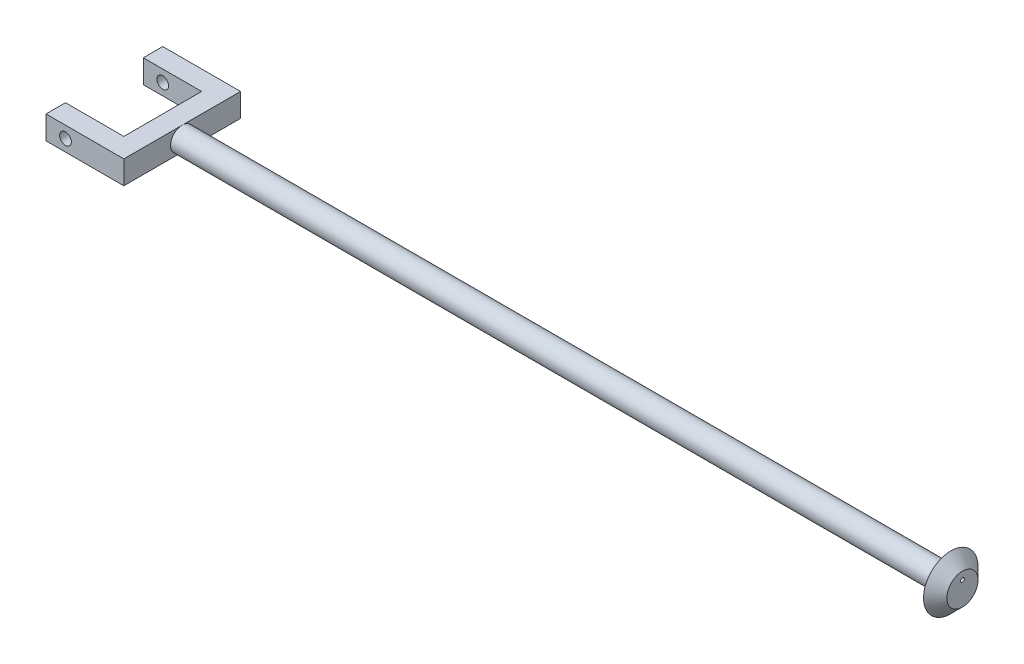
ISO-10303-21;
HEADER;
FILE_DESCRIPTION(('STEP AP214'),'2;1');
FILE_NAME('part.step','',(''),(''),'','','');
FILE_SCHEMA(('AUTOMOTIVE_DESIGN { 1 0 10303 214 1 1 1 1 }'));
ENDSEC;
DATA;
#1=APPLICATION_CONTEXT('core data for automotive mechanical design processes');
#2=APPLICATION_PROTOCOL_DEFINITION('international standard','automotive_design',2000,#1);
#3=PRODUCT_CONTEXT('',#1,'mechanical');
#4=PRODUCT('Part','Part','',(#3));
#5=PRODUCT_RELATED_PRODUCT_CATEGORY('part','',(#4));
#6=PRODUCT_DEFINITION_FORMATION('','',#4);
#7=PRODUCT_DEFINITION_CONTEXT('part definition',#1,'design');
#8=PRODUCT_DEFINITION('design','',#6,#7);
#9=PRODUCT_DEFINITION_SHAPE('','',#8);
#10=(LENGTH_UNIT() NAMED_UNIT(*) SI_UNIT(.MILLI.,.METRE.));
#11=(NAMED_UNIT(*) PLANE_ANGLE_UNIT() SI_UNIT($,.RADIAN.));
#12=(NAMED_UNIT(*) SI_UNIT($,.STERADIAN.) SOLID_ANGLE_UNIT());
#13=UNCERTAINTY_MEASURE_WITH_UNIT(LENGTH_MEASURE(1.E-05),#10,'distance_accuracy_value','');
#14=(GEOMETRIC_REPRESENTATION_CONTEXT(3) GLOBAL_UNCERTAINTY_ASSIGNED_CONTEXT((#13)) GLOBAL_UNIT_ASSIGNED_CONTEXT((#10,
#11,#12)) REPRESENTATION_CONTEXT('',''));
#15=CARTESIAN_POINT('',(0.,0.,0.));
#16=DIRECTION('',(0.,0.,1.));
#17=DIRECTION('',(1.,0.,0.));
#18=AXIS2_PLACEMENT_3D('',#15,#16,#17);
#19=CARTESIAN_POINT('',(-8.75000000000008,0.,-125.));
#20=DIRECTION('',(1.,0.,0.));
#21=DIRECTION('',(0.,0.,-1.));
#22=AXIS2_PLACEMENT_3D('',#19,#20,#21);
#23=PLANE('',#22);
#24=CARTESIAN_POINT('',(-8.75000000000008,0.,-125.));
#25=DIRECTION('',(-1.,0.,0.));
#26=DIRECTION('',(0.,0.,1.));
#27=AXIS2_PLACEMENT_3D('',#24,#25,#26);
#28=CIRCLE('',#27,1.5);
#29=CARTESIAN_POINT('',(-8.75000000000008,0.,-123.5));
#30=VERTEX_POINT('',#29);
#31=EDGE_CURVE('E11',#30,#30,#28,.T.);
#32=ORIENTED_EDGE('',*,*,#31,.F.);
#33=EDGE_LOOP('',(#32));
#34=FACE_BOUND('',#33,.T.);
#35=CARTESIAN_POINT('',(-8.75000000000008,0.,-125.));
#36=DIRECTION('',(1.,0.,0.));
#37=DIRECTION('',(0.,0.,-1.));
#38=AXIS2_PLACEMENT_3D('',#35,#36,#37);
#39=CIRCLE('',#38,3.50000000000003);
#40=CARTESIAN_POINT('',(-8.75000000000008,0.,-128.5));
#41=VERTEX_POINT('',#40);
#42=EDGE_CURVE('E226',#41,#41,#39,.T.);
#43=ORIENTED_EDGE('',*,*,#42,.F.);
#44=EDGE_LOOP('',(#43));
#45=FACE_BOUND('',#44,.T.);
#46=ADVANCED_FACE('F48',(#34,#45),#23,.F.);
#47=CARTESIAN_POINT('',(-100.,0.,-125.));
#48=DIRECTION('',(1.,0.,0.));
#49=DIRECTION('',(0.,0.,-1.));
#50=AXIS2_PLACEMENT_3D('',#47,#48,#49);
#51=CYLINDRICAL_SURFACE('',#50,1.5);
#52=ORIENTED_EDGE('',*,*,#31,.T.);
#53=EDGE_LOOP('',(#52));
#54=FACE_BOUND('',#53,.T.);
#55=CARTESIAN_POINT('',(-107.5,0.,-125.));
#56=DIRECTION('',(-1.,0.,0.));
#57=DIRECTION('',(0.,0.,1.));
#58=AXIS2_PLACEMENT_3D('',#55,#56,#57);
#59=CIRCLE('',#58,1.5);
#60=CARTESIAN_POINT('',(-107.5,1.5,-125.));
#61=VERTEX_POINT('',#60);
#62=CARTESIAN_POINT('',(-107.5,-1.5,-125.));
#63=VERTEX_POINT('',#62);
#64=EDGE_CURVE('E65',#61,#63,#59,.T.);
#65=ORIENTED_EDGE('',*,*,#64,.F.);
#66=EDGE_CURVE('E62',#63,#61,#59,.T.);
#67=ORIENTED_EDGE('',*,*,#66,.F.);
#68=EDGE_LOOP('',(#65,#67));
#69=FACE_BOUND('',#68,.T.);
#70=ADVANCED_FACE('F241',(#54,#69),#51,.T.);
#71=CARTESIAN_POINT('',(-8.75000000000008,0.,-125.));
#72=DIRECTION('',(-1.,0.,0.));
#73=DIRECTION('',(0.,0.,1.));
#74=AXIS2_PLACEMENT_3D('',#71,#72,#73);
#75=CONICAL_SURFACE('',#74,3.50000000000003,0.78539816339744);
#76=CARTESIAN_POINT('',(-7.25000000000008,0.,-125.));
#77=DIRECTION('',(1.,0.,0.));
#78=DIRECTION('',(0.,0.,-1.));
#79=AXIS2_PLACEMENT_3D('',#76,#77,#78);
#80=CIRCLE('',#79,2.00000000000006);
#81=CARTESIAN_POINT('',(-7.25000000000008,0.,-127.));
#82=VERTEX_POINT('',#81);
#83=EDGE_CURVE('E56',#82,#82,#80,.T.);
#84=ORIENTED_EDGE('',*,*,#83,.F.);
#85=EDGE_LOOP('',(#84));
#86=FACE_BOUND('',#85,.T.);
#87=ORIENTED_EDGE('',*,*,#42,.T.);
#88=EDGE_LOOP('',(#87));
#89=FACE_BOUND('',#88,.T.);
#90=ADVANCED_FACE('F238',(#86,#89),#75,.T.);
#91=CARTESIAN_POINT('',(-7.25000000000008,0.,-125.));
#92=DIRECTION('',(1.,0.,0.));
#93=DIRECTION('',(0.,0.,-1.));
#94=AXIS2_PLACEMENT_3D('',#91,#92,#93);
#95=PLANE('',#94);
#96=CARTESIAN_POINT('',(-7.25000000000008,1.00000000000003,-125.));
#97=DIRECTION('',(1.,0.,0.));
#98=DIRECTION('',(0.,0.,-1.));
#99=AXIS2_PLACEMENT_3D('',#96,#97,#98);
#100=CIRCLE('',#99,0.250000000000013);
#101=CARTESIAN_POINT('',(-7.25000000000008,1.00000000000003,-125.25));
#102=VERTEX_POINT('',#101);
#103=EDGE_CURVE('E221',#102,#102,#100,.T.);
#104=ORIENTED_EDGE('',*,*,#103,.F.);
#105=EDGE_LOOP('',(#104));
#106=FACE_BOUND('',#105,.T.);
#107=ORIENTED_EDGE('',*,*,#83,.T.);
#108=EDGE_LOOP('',(#107));
#109=FACE_BOUND('',#108,.T.);
#110=ADVANCED_FACE('F236',(#106,#109),#95,.T.);
#111=CARTESIAN_POINT('',(-8.25000000000008,1.00000000000003,-125.));
#112=DIRECTION('',(1.,0.,0.));
#113=DIRECTION('',(0.,0.,-1.));
#114=AXIS2_PLACEMENT_3D('',#111,#112,#113);
#115=CYLINDRICAL_SURFACE('',#114,0.250000000000013);
#116=CARTESIAN_POINT('',(-8.25000000000008,1.00000000000003,-125.));
#117=DIRECTION('',(1.,0.,0.));
#118=DIRECTION('',(0.,0.,-1.));
#119=AXIS2_PLACEMENT_3D('',#116,#117,#118);
#120=CIRCLE('',#119,0.250000000000013);
#121=CARTESIAN_POINT('',(-8.25000000000008,1.00000000000003,-125.25));
#122=VERTEX_POINT('',#121);
#123=EDGE_CURVE('E222',#122,#122,#120,.T.);
#124=ORIENTED_EDGE('',*,*,#123,.F.);
#125=EDGE_LOOP('',(#124));
#126=FACE_BOUND('',#125,.T.);
#127=ORIENTED_EDGE('',*,*,#103,.T.);
#128=EDGE_LOOP('',(#127));
#129=FACE_BOUND('',#128,.T.);
#130=ADVANCED_FACE('F261',(#126,#129),#115,.F.);
#131=CARTESIAN_POINT('',(-8.25000000000008,0.,0.));
#132=DIRECTION('',(1.,0.,0.));
#133=DIRECTION('',(0.,0.,-1.));
#134=AXIS2_PLACEMENT_3D('',#131,#132,#133);
#135=PLANE('',#134);
#136=ORIENTED_EDGE('',*,*,#123,.T.);
#137=EDGE_LOOP('',(#136));
#138=FACE_BOUND('',#137,.T.);
#139=ADVANCED_FACE('F266',(#138),#135,.T.);
#140=CARTESIAN_POINT('',(-107.5,-1.5,0.));
#141=DIRECTION('',(-1.,0.,0.));
#142=DIRECTION('',(0.,0.,1.));
#143=AXIS2_PLACEMENT_3D('',#140,#141,#142);
#144=PLANE('',#143);
#145=DIRECTION('',(0.,0.,1.));
#146=VECTOR('',#145,1.);
#147=CARTESIAN_POINT('',(-107.5,1.5,0.));
#148=LINE('',#147,#146);
#149=CARTESIAN_POINT('',(-107.5,1.5,-132.5));
#150=VERTEX_POINT('',#149);
#151=EDGE_CURVE('E149',#150,#61,#148,.T.);
#152=ORIENTED_EDGE('',*,*,#151,.T.);
#153=ORIENTED_EDGE('',*,*,#64,.T.);
#154=DIRECTION('',(0.,0.,1.));
#155=VECTOR('',#154,1.);
#156=CARTESIAN_POINT('',(-107.5,-1.5,0.));
#157=LINE('',#156,#155);
#158=CARTESIAN_POINT('',(-107.5,-1.5,-132.5));
#159=VERTEX_POINT('',#158);
#160=EDGE_CURVE('E178',#159,#63,#157,.T.);
#161=ORIENTED_EDGE('',*,*,#160,.F.);
#162=DIRECTION('',(0.,1.,0.));
#163=VECTOR('',#162,1.);
#164=CARTESIAN_POINT('',(-107.5,-1.5,-132.5));
#165=LINE('',#164,#163);
#166=EDGE_CURVE('E214',#159,#150,#165,.T.);
#167=ORIENTED_EDGE('',*,*,#166,.T.);
#168=EDGE_LOOP('',(#152,#153,#161,#167));
#169=FACE_BOUND('',#168,.T.);
#170=ADVANCED_FACE('F272',(#169),#144,.F.);
#171=CARTESIAN_POINT('',(-107.5,-1.5,-117.5));
#172=VERTEX_POINT('',#171);
#173=EDGE_CURVE('E177',#63,#172,#157,.T.);
#174=ORIENTED_EDGE('',*,*,#173,.F.);
#175=ORIENTED_EDGE('',*,*,#66,.T.);
#176=CARTESIAN_POINT('',(-107.5,1.5,-117.5));
#177=VERTEX_POINT('',#176);
#178=EDGE_CURVE('E146',#61,#177,#148,.T.);
#179=ORIENTED_EDGE('',*,*,#178,.T.);
#180=DIRECTION('',(0.,1.,0.));
#181=VECTOR('',#180,1.);
#182=CARTESIAN_POINT('',(-107.5,-1.5,-117.5));
#183=LINE('',#182,#181);
#184=EDGE_CURVE('E127',#172,#177,#183,.T.);
#185=ORIENTED_EDGE('',*,*,#184,.F.);
#186=EDGE_LOOP('',(#174,#175,#179,#185));
#187=FACE_BOUND('',#186,.T.);
#188=ADVANCED_FACE('F280',(#187),#144,.F.);
#189=CARTESIAN_POINT('',(-117.5,-1.5,0.));
#190=DIRECTION('',(1.,0.,0.));
#191=DIRECTION('',(0.,0.,-1.));
#192=AXIS2_PLACEMENT_3D('',#189,#190,#191);
#193=PLANE('',#192);
#194=DIRECTION('',(0.,1.,0.));
#195=VECTOR('',#194,1.);
#196=CARTESIAN_POINT('',(-117.5,-1.5,-117.5));
#197=LINE('',#196,#195);
#198=CARTESIAN_POINT('',(-117.5,-1.5,-117.5));
#199=VERTEX_POINT('',#198);
#200=CARTESIAN_POINT('',(-117.5,1.5,-117.5));
#201=VERTEX_POINT('',#200);
#202=EDGE_CURVE('E117',#199,#201,#197,.T.);
#203=ORIENTED_EDGE('',*,*,#202,.T.);
#204=DIRECTION('',(0.,0.,-1.));
#205=VECTOR('',#204,1.);
#206=CARTESIAN_POINT('',(-117.5,1.5,0.));
#207=LINE('',#206,#205);
#208=CARTESIAN_POINT('',(-117.5,1.5,-120.));
#209=VERTEX_POINT('',#208);
#210=EDGE_CURVE('E121',#201,#209,#207,.T.);
#211=ORIENTED_EDGE('',*,*,#210,.T.);
#212=DIRECTION('',(0.,1.,0.));
#213=VECTOR('',#212,1.);
#214=CARTESIAN_POINT('',(-117.5,-1.5,-120.));
#215=LINE('',#214,#213);
#216=CARTESIAN_POINT('',(-117.5,-1.5,-120.));
#217=VERTEX_POINT('',#216);
#218=EDGE_CURVE('E199',#217,#209,#215,.T.);
#219=ORIENTED_EDGE('',*,*,#218,.F.);
#220=DIRECTION('',(0.,0.,-1.));
#221=VECTOR('',#220,1.);
#222=CARTESIAN_POINT('',(-117.5,-1.5,0.));
#223=LINE('',#222,#221);
#224=EDGE_CURVE('E122',#199,#217,#223,.T.);
#225=ORIENTED_EDGE('',*,*,#224,.F.);
#226=EDGE_LOOP('',(#203,#211,#219,#225));
#227=FACE_BOUND('',#226,.T.);
#228=ADVANCED_FACE('F119',(#227),#193,.F.);
#229=CARTESIAN_POINT('',(0.,-1.5,-120.));
#230=DIRECTION('',(0.,0.,-1.));
#231=DIRECTION('',(-1.,0.,0.));
#232=AXIS2_PLACEMENT_3D('',#229,#230,#231);
#233=PLANE('',#232);
#234=CARTESIAN_POINT('',(-115.,0.,-120.));
#235=DIRECTION('',(0.,0.,-1.));
#236=DIRECTION('',(-1.,0.,0.));
#237=AXIS2_PLACEMENT_3D('',#234,#235,#236);
#238=CIRCLE('',#237,0.749999999999999);
#239=CARTESIAN_POINT('',(-115.75,0.,-120.));
#240=VERTEX_POINT('',#239);
#241=EDGE_CURVE('E140',#240,#240,#238,.T.);
#242=ORIENTED_EDGE('',*,*,#241,.F.);
#243=EDGE_LOOP('',(#242));
#244=FACE_BOUND('',#243,.T.);
#245=ORIENTED_EDGE('',*,*,#218,.T.);
#246=DIRECTION('',(-1.,0.,0.));
#247=VECTOR('',#246,1.);
#248=CARTESIAN_POINT('',(0.,1.5,-120.));
#249=LINE('',#248,#247);
#250=CARTESIAN_POINT('',(-110.,1.5,-120.));
#251=VERTEX_POINT('',#250);
#252=EDGE_CURVE('E138',#251,#209,#249,.T.);
#253=ORIENTED_EDGE('',*,*,#252,.F.);
#254=DIRECTION('',(0.,1.,0.));
#255=VECTOR('',#254,1.);
#256=CARTESIAN_POINT('',(-110.,-1.5,-120.));
#257=LINE('',#256,#255);
#258=CARTESIAN_POINT('',(-110.,-1.5,-120.));
#259=VERTEX_POINT('',#258);
#260=EDGE_CURVE('E202',#259,#251,#257,.T.);
#261=ORIENTED_EDGE('',*,*,#260,.F.);
#262=DIRECTION('',(-1.,0.,0.));
#263=VECTOR('',#262,1.);
#264=CARTESIAN_POINT('',(0.,-1.5,-120.));
#265=LINE('',#264,#263);
#266=EDGE_CURVE('E128',#259,#217,#265,.T.);
#267=ORIENTED_EDGE('',*,*,#266,.T.);
#268=EDGE_LOOP('',(#245,#253,#261,#267));
#269=FACE_BOUND('',#268,.T.);
#270=ADVANCED_FACE('F279',(#244,#269),#233,.T.);
#271=CARTESIAN_POINT('',(-110.,-1.5,0.));
#272=DIRECTION('',(-1.,0.,0.));
#273=DIRECTION('',(0.,0.,1.));
#274=AXIS2_PLACEMENT_3D('',#271,#272,#273);
#275=PLANE('',#274);
#276=ORIENTED_EDGE('',*,*,#260,.T.);
#277=DIRECTION('',(0.,0.,1.));
#278=VECTOR('',#277,1.);
#279=CARTESIAN_POINT('',(-110.,1.5,0.));
#280=LINE('',#279,#278);
#281=CARTESIAN_POINT('',(-110.,1.5,-130.));
#282=VERTEX_POINT('',#281);
#283=EDGE_CURVE('E167',#282,#251,#280,.T.);
#284=ORIENTED_EDGE('',*,*,#283,.F.);
#285=DIRECTION('',(0.,1.,0.));
#286=VECTOR('',#285,1.);
#287=CARTESIAN_POINT('',(-110.,-1.5,-130.));
#288=LINE('',#287,#286);
#289=CARTESIAN_POINT('',(-110.,-1.5,-130.));
#290=VERTEX_POINT('',#289);
#291=EDGE_CURVE('E205',#290,#282,#288,.T.);
#292=ORIENTED_EDGE('',*,*,#291,.F.);
#293=DIRECTION('',(0.,0.,1.));
#294=VECTOR('',#293,1.);
#295=CARTESIAN_POINT('',(-110.,-1.5,0.));
#296=LINE('',#295,#294);
#297=EDGE_CURVE('E192',#290,#259,#296,.T.);
#298=ORIENTED_EDGE('',*,*,#297,.T.);
#299=EDGE_LOOP('',(#276,#284,#292,#298));
#300=FACE_BOUND('',#299,.T.);
#301=ADVANCED_FACE('F298',(#300),#275,.T.);
#302=CARTESIAN_POINT('',(0.,-1.5,-130.));
#303=DIRECTION('',(0.,0.,-1.));
#304=DIRECTION('',(-1.,0.,0.));
#305=AXIS2_PLACEMENT_3D('',#302,#303,#304);
#306=PLANE('',#305);
#307=CARTESIAN_POINT('',(-115.,0.,-130.));
#308=DIRECTION('',(0.,0.,-1.));
#309=DIRECTION('',(-1.,0.,0.));
#310=AXIS2_PLACEMENT_3D('',#307,#308,#309);
#311=CIRCLE('',#310,0.749999999999999);
#312=CARTESIAN_POINT('',(-115.75,0.,-130.));
#313=VERTEX_POINT('',#312);
#314=EDGE_CURVE('E330',#313,#313,#311,.T.);
#315=ORIENTED_EDGE('',*,*,#314,.T.);
#316=EDGE_LOOP('',(#315));
#317=FACE_BOUND('',#316,.T.);
#318=ORIENTED_EDGE('',*,*,#291,.T.);
#319=DIRECTION('',(-1.,0.,0.));
#320=VECTOR('',#319,1.);
#321=CARTESIAN_POINT('',(0.,1.5,-130.));
#322=LINE('',#321,#320);
#323=CARTESIAN_POINT('',(-117.5,1.5,-130.));
#324=VERTEX_POINT('',#323);
#325=EDGE_CURVE('E163',#282,#324,#322,.T.);
#326=ORIENTED_EDGE('',*,*,#325,.T.);
#327=DIRECTION('',(0.,1.,0.));
#328=VECTOR('',#327,1.);
#329=CARTESIAN_POINT('',(-117.5,-1.5,-130.));
#330=LINE('',#329,#328);
#331=CARTESIAN_POINT('',(-117.5,-1.5,-130.));
#332=VERTEX_POINT('',#331);
#333=EDGE_CURVE('E208',#332,#324,#330,.T.);
#334=ORIENTED_EDGE('',*,*,#333,.F.);
#335=DIRECTION('',(-1.,0.,0.));
#336=VECTOR('',#335,1.);
#337=CARTESIAN_POINT('',(0.,-1.5,-130.));
#338=LINE('',#337,#336);
#339=EDGE_CURVE('E189',#290,#332,#338,.T.);
#340=ORIENTED_EDGE('',*,*,#339,.F.);
#341=EDGE_LOOP('',(#318,#326,#334,#340));
#342=FACE_BOUND('',#341,.T.);
#343=ADVANCED_FACE('F294',(#317,#342),#306,.F.);
#344=CARTESIAN_POINT('',(-117.5,-1.5,0.));
#345=DIRECTION('',(-1.,0.,0.));
#346=DIRECTION('',(0.,0.,1.));
#347=AXIS2_PLACEMENT_3D('',#344,#345,#346);
#348=PLANE('',#347);
#349=ORIENTED_EDGE('',*,*,#333,.T.);
#350=DIRECTION('',(0.,0.,1.));
#351=VECTOR('',#350,1.);
#352=CARTESIAN_POINT('',(-117.5,1.5,0.));
#353=LINE('',#352,#351);
#354=CARTESIAN_POINT('',(-117.5,1.5,-132.5));
#355=VERTEX_POINT('',#354);
#356=EDGE_CURVE('E159',#355,#324,#353,.T.);
#357=ORIENTED_EDGE('',*,*,#356,.F.);
#358=DIRECTION('',(0.,1.,0.));
#359=VECTOR('',#358,1.);
#360=CARTESIAN_POINT('',(-117.5,-1.5,-132.5));
#361=LINE('',#360,#359);
#362=CARTESIAN_POINT('',(-117.5,-1.5,-132.5));
#363=VERTEX_POINT('',#362);
#364=EDGE_CURVE('E211',#363,#355,#361,.T.);
#365=ORIENTED_EDGE('',*,*,#364,.F.);
#366=DIRECTION('',(0.,0.,1.));
#367=VECTOR('',#366,1.);
#368=CARTESIAN_POINT('',(-117.5,-1.5,0.));
#369=LINE('',#368,#367);
#370=EDGE_CURVE('E185',#363,#332,#369,.T.);
#371=ORIENTED_EDGE('',*,*,#370,.T.);
#372=EDGE_LOOP('',(#349,#357,#365,#371));
#373=FACE_BOUND('',#372,.T.);
#374=ADVANCED_FACE('F290',(#373),#348,.T.);
#375=CARTESIAN_POINT('',(0.,-1.5,-132.5));
#376=DIRECTION('',(0.,0.,1.));
#377=DIRECTION('',(1.,0.,0.));
#378=AXIS2_PLACEMENT_3D('',#375,#376,#377);
#379=PLANE('',#378);
#380=CARTESIAN_POINT('',(-115.,0.,-132.5));
#381=DIRECTION('',(0.,0.,1.));
#382=DIRECTION('',(1.,0.,0.));
#383=AXIS2_PLACEMENT_3D('',#380,#381,#382);
#384=CIRCLE('',#383,0.749999999999999);
#385=CARTESIAN_POINT('',(-114.25,0.,-132.5));
#386=VERTEX_POINT('',#385);
#387=EDGE_CURVE('E326',#386,#386,#384,.T.);
#388=ORIENTED_EDGE('',*,*,#387,.T.);
#389=EDGE_LOOP('',(#388));
#390=FACE_BOUND('',#389,.T.);
#391=ORIENTED_EDGE('',*,*,#364,.T.);
#392=DIRECTION('',(1.,0.,0.));
#393=VECTOR('',#392,1.);
#394=CARTESIAN_POINT('',(0.,1.5,-132.5));
#395=LINE('',#394,#393);
#396=EDGE_CURVE('E155',#355,#150,#395,.T.);
#397=ORIENTED_EDGE('',*,*,#396,.T.);
#398=ORIENTED_EDGE('',*,*,#166,.F.);
#399=DIRECTION('',(1.,0.,0.));
#400=VECTOR('',#399,1.);
#401=CARTESIAN_POINT('',(0.,-1.5,-132.5));
#402=LINE('',#401,#400);
#403=EDGE_CURVE('E182',#363,#159,#402,.T.);
#404=ORIENTED_EDGE('',*,*,#403,.F.);
#405=EDGE_LOOP('',(#391,#397,#398,#404));
#406=FACE_BOUND('',#405,.T.);
#407=ADVANCED_FACE('F284',(#390,#406),#379,.F.);
#408=CARTESIAN_POINT('',(0.,-1.5,-117.5));
#409=DIRECTION('',(0.,0.,-1.));
#410=DIRECTION('',(-1.,0.,0.));
#411=AXIS2_PLACEMENT_3D('',#408,#409,#410);
#412=PLANE('',#411);
#413=CARTESIAN_POINT('',(-115.,0.,-117.5));
#414=DIRECTION('',(0.,0.,1.));
#415=DIRECTION('',(1.,0.,0.));
#416=AXIS2_PLACEMENT_3D('',#413,#414,#415);
#417=CIRCLE('',#416,0.749999999999999);
#418=CARTESIAN_POINT('',(-114.25,0.,-117.5));
#419=VERTEX_POINT('',#418);
#420=EDGE_CURVE('E324',#419,#419,#417,.T.);
#421=ORIENTED_EDGE('',*,*,#420,.F.);
#422=EDGE_LOOP('',(#421));
#423=FACE_BOUND('',#422,.T.);
#424=ORIENTED_EDGE('',*,*,#184,.T.);
#425=DIRECTION('',(-1.,0.,0.));
#426=VECTOR('',#425,1.);
#427=CARTESIAN_POINT('',(0.,1.5,-117.5));
#428=LINE('',#427,#426);
#429=EDGE_CURVE('E135',#177,#201,#428,.T.);
#430=ORIENTED_EDGE('',*,*,#429,.T.);
#431=ORIENTED_EDGE('',*,*,#202,.F.);
#432=DIRECTION('',(-1.,0.,0.));
#433=VECTOR('',#432,1.);
#434=CARTESIAN_POINT('',(0.,-1.5,-117.5));
#435=LINE('',#434,#433);
#436=EDGE_CURVE('E174',#172,#199,#435,.T.);
#437=ORIENTED_EDGE('',*,*,#436,.F.);
#438=EDGE_LOOP('',(#424,#430,#431,#437));
#439=FACE_BOUND('',#438,.T.);
#440=ADVANCED_FACE('F143',(#423,#439),#412,.F.);
#441=CARTESIAN_POINT('',(0.,-1.5,0.));
#442=DIRECTION('',(0.,1.,0.));
#443=DIRECTION('',(0.,0.,1.));
#444=AXIS2_PLACEMENT_3D('',#441,#442,#443);
#445=PLANE('',#444);
#446=ORIENTED_EDGE('',*,*,#224,.T.);
#447=ORIENTED_EDGE('',*,*,#266,.F.);
#448=ORIENTED_EDGE('',*,*,#297,.F.);
#449=ORIENTED_EDGE('',*,*,#339,.T.);
#450=ORIENTED_EDGE('',*,*,#370,.F.);
#451=ORIENTED_EDGE('',*,*,#403,.T.);
#452=ORIENTED_EDGE('',*,*,#160,.T.);
#453=ORIENTED_EDGE('',*,*,#173,.T.);
#454=ORIENTED_EDGE('',*,*,#436,.T.);
#455=EDGE_LOOP('',(#446,#447,#448,#449,#450,#451,#452,#453,#454));
#456=FACE_BOUND('',#455,.T.);
#457=ADVANCED_FACE('F283',(#456),#445,.F.);
#458=CARTESIAN_POINT('',(0.,1.5,0.));
#459=DIRECTION('',(0.,1.,0.));
#460=DIRECTION('',(0.,0.,1.));
#461=AXIS2_PLACEMENT_3D('',#458,#459,#460);
#462=PLANE('',#461);
#463=ORIENTED_EDGE('',*,*,#210,.F.);
#464=ORIENTED_EDGE('',*,*,#429,.F.);
#465=ORIENTED_EDGE('',*,*,#178,.F.);
#466=ORIENTED_EDGE('',*,*,#151,.F.);
#467=ORIENTED_EDGE('',*,*,#396,.F.);
#468=ORIENTED_EDGE('',*,*,#356,.T.);
#469=ORIENTED_EDGE('',*,*,#325,.F.);
#470=ORIENTED_EDGE('',*,*,#283,.T.);
#471=ORIENTED_EDGE('',*,*,#252,.T.);
#472=EDGE_LOOP('',(#463,#464,#465,#466,#467,#468,#469,#470,#471));
#473=FACE_BOUND('',#472,.T.);
#474=ADVANCED_FACE('F133',(#473),#462,.T.);
#475=CARTESIAN_POINT('',(-115.,0.,-132.5));
#476=DIRECTION('',(0.,0.,1.));
#477=DIRECTION('',(1.,0.,0.));
#478=AXIS2_PLACEMENT_3D('',#475,#476,#477);
#479=CYLINDRICAL_SURFACE('',#478,0.749999999999999);
#480=ORIENTED_EDGE('',*,*,#241,.T.);
#481=EDGE_LOOP('',(#480));
#482=FACE_BOUND('',#481,.T.);
#483=ORIENTED_EDGE('',*,*,#420,.T.);
#484=EDGE_LOOP('',(#483));
#485=FACE_BOUND('',#484,.T.);
#486=ADVANCED_FACE('F311',(#482,#485),#479,.F.);
#487=ORIENTED_EDGE('',*,*,#387,.F.);
#488=EDGE_LOOP('',(#487));
#489=FACE_BOUND('',#488,.T.);
#490=ORIENTED_EDGE('',*,*,#314,.F.);
#491=EDGE_LOOP('',(#490));
#492=FACE_BOUND('',#491,.T.);
#493=ADVANCED_FACE('F313',(#489,#492),#479,.F.);
#494=CLOSED_SHELL('',(#46,#70,#90,#110,#130,#139,#170,#188,#228,#270,#301,#343,#374,#407,#440,
#457,#474,#486,#493));
#495=MANIFOLD_SOLID_BREP('B2',#494);
#496=ADVANCED_BREP_SHAPE_REPRESENTATION('',(#18,#495),#14);
#497=SHAPE_DEFINITION_REPRESENTATION(#9,#496);
ENDSEC;
END-ISO-10303-21;
